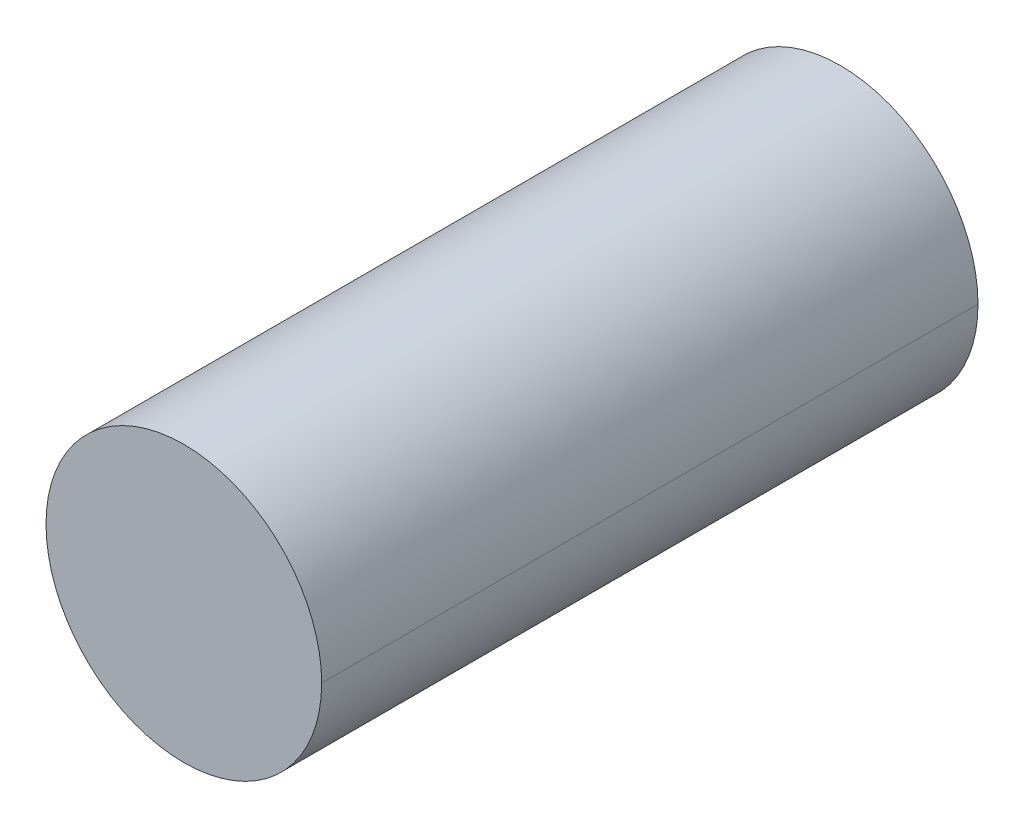
ISO-10303-21;
HEADER;
FILE_DESCRIPTION(('STEP AP214'),'2;1');
FILE_NAME('part.step','',(''),(''),'','','');
FILE_SCHEMA(('AUTOMOTIVE_DESIGN { 1 0 10303 214 1 1 1 1 }'));
ENDSEC;
DATA;
#1=APPLICATION_CONTEXT('core data for automotive mechanical design processes');
#2=APPLICATION_PROTOCOL_DEFINITION('international standard','automotive_design',2000,#1);
#3=PRODUCT_CONTEXT('',#1,'mechanical');
#4=PRODUCT('Part','Part','',(#3));
#5=PRODUCT_RELATED_PRODUCT_CATEGORY('part','',(#4));
#6=PRODUCT_DEFINITION_FORMATION('','',#4);
#7=PRODUCT_DEFINITION_CONTEXT('part definition',#1,'design');
#8=PRODUCT_DEFINITION('design','',#6,#7);
#9=PRODUCT_DEFINITION_SHAPE('','',#8);
#10=(LENGTH_UNIT() NAMED_UNIT(*) SI_UNIT(.MILLI.,.METRE.));
#11=(NAMED_UNIT(*) PLANE_ANGLE_UNIT() SI_UNIT($,.RADIAN.));
#12=(NAMED_UNIT(*) SI_UNIT($,.STERADIAN.) SOLID_ANGLE_UNIT());
#13=UNCERTAINTY_MEASURE_WITH_UNIT(LENGTH_MEASURE(1.E-05),#10,'distance_accuracy_value','');
#14=(GEOMETRIC_REPRESENTATION_CONTEXT(3) GLOBAL_UNCERTAINTY_ASSIGNED_CONTEXT((#13)) GLOBAL_UNIT_ASSIGNED_CONTEXT((#10,
#11,#12)) REPRESENTATION_CONTEXT('',''));
#15=CARTESIAN_POINT('',(0.,0.,0.));
#16=DIRECTION('',(0.,0.,1.));
#17=DIRECTION('',(1.,0.,0.));
#18=AXIS2_PLACEMENT_3D('',#15,#16,#17);
#19=CARTESIAN_POINT('',(0.,0.,-41.5));
#20=DIRECTION('',(0.,0.,-1.));
#21=DIRECTION('',(0.,-1.,0.));
#22=AXIS2_PLACEMENT_3D('',#19,#20,#21);
#23=PLANE('',#22);
#24=CARTESIAN_POINT('',(0.,0.,-41.5));
#25=DIRECTION('',(0.,0.,-1.));
#26=DIRECTION('',(-1.,0.,0.));
#27=AXIS2_PLACEMENT_3D('',#24,#25,#26);
#28=CIRCLE('',#27,2.1);
#29=CARTESIAN_POINT('',(-2.1,0.,-41.5));
#30=VERTEX_POINT('',#29);
#31=CARTESIAN_POINT('',(2.1,0.,-41.5));
#32=VERTEX_POINT('',#31);
#33=EDGE_CURVE('E11',#30,#32,#28,.T.);
#34=ORIENTED_EDGE('',*,*,#33,.T.);
#35=CARTESIAN_POINT('',(0.,0.,-41.5));
#36=DIRECTION('',(0.,0.,-1.));
#37=DIRECTION('',(1.,0.,0.));
#38=AXIS2_PLACEMENT_3D('',#35,#36,#37);
#39=CIRCLE('',#38,2.1);
#40=EDGE_CURVE('E20',#32,#30,#39,.T.);
#41=ORIENTED_EDGE('',*,*,#40,.T.);
#42=EDGE_LOOP('',(#34,#41));
#43=FACE_BOUND('',#42,.T.);
#44=ADVANCED_FACE('F16',(#43),#23,.T.);
#45=CARTESIAN_POINT('',(0.,0.,-41.5));
#46=DIRECTION('',(0.,0.,1.));
#47=DIRECTION('',(1.,0.,0.));
#48=AXIS2_PLACEMENT_3D('',#45,#46,#47);
#49=CYLINDRICAL_SURFACE('',#48,2.1);
#50=DIRECTION('',(0.,0.,-1.));
#51=VECTOR('',#50,1.);
#52=CARTESIAN_POINT('',(-2.1,0.,-31.5));
#53=LINE('',#52,#51);
#54=CARTESIAN_POINT('',(-2.1,0.,-31.5));
#55=VERTEX_POINT('',#54);
#56=EDGE_CURVE('E27',#55,#30,#53,.T.);
#57=ORIENTED_EDGE('',*,*,#56,.F.);
#58=CARTESIAN_POINT('',(0.,0.,-31.5));
#59=DIRECTION('',(0.,0.,1.));
#60=DIRECTION('',(1.,0.,0.));
#61=AXIS2_PLACEMENT_3D('',#58,#59,#60);
#62=CIRCLE('',#61,2.1);
#63=CARTESIAN_POINT('',(2.1,0.,-31.5));
#64=VERTEX_POINT('',#63);
#65=EDGE_CURVE('E56',#64,#55,#62,.T.);
#66=ORIENTED_EDGE('',*,*,#65,.F.);
#67=DIRECTION('',(0.,0.,-1.));
#68=VECTOR('',#67,1.);
#69=CARTESIAN_POINT('',(2.1,0.,-31.5));
#70=LINE('',#69,#68);
#71=EDGE_CURVE('E50',#64,#32,#70,.T.);
#72=ORIENTED_EDGE('',*,*,#71,.T.);
#73=ORIENTED_EDGE('',*,*,#33,.F.);
#74=EDGE_LOOP('',(#57,#66,#72,#73));
#75=FACE_BOUND('',#74,.T.);
#76=ADVANCED_FACE('F18',(#75),#49,.T.);
#77=CARTESIAN_POINT('',(0.,0.,-41.5));
#78=DIRECTION('',(0.,0.,1.));
#79=DIRECTION('',(1.,0.,0.));
#80=AXIS2_PLACEMENT_3D('',#77,#78,#79);
#81=CYLINDRICAL_SURFACE('',#80,2.1);
#82=ORIENTED_EDGE('',*,*,#40,.F.);
#83=ORIENTED_EDGE('',*,*,#71,.F.);
#84=CARTESIAN_POINT('',(0.,0.,-31.5));
#85=DIRECTION('',(0.,0.,1.));
#86=DIRECTION('',(-1.,0.,0.));
#87=AXIS2_PLACEMENT_3D('',#84,#85,#86);
#88=CIRCLE('',#87,2.1);
#89=EDGE_CURVE('E59',#55,#64,#88,.T.);
#90=ORIENTED_EDGE('',*,*,#89,.F.);
#91=ORIENTED_EDGE('',*,*,#56,.T.);
#92=EDGE_LOOP('',(#82,#83,#90,#91));
#93=FACE_BOUND('',#92,.T.);
#94=ADVANCED_FACE('F60',(#93),#81,.T.);
#95=CARTESIAN_POINT('',(0.,0.,-31.5));
#96=DIRECTION('',(0.,0.,-1.));
#97=DIRECTION('',(0.,-1.,0.));
#98=AXIS2_PLACEMENT_3D('',#95,#96,#97);
#99=PLANE('',#98);
#100=ORIENTED_EDGE('',*,*,#65,.T.);
#101=ORIENTED_EDGE('',*,*,#89,.T.);
#102=EDGE_LOOP('',(#100,#101));
#103=FACE_BOUND('',#102,.T.);
#104=ADVANCED_FACE('F64',(#103),#99,.F.);
#105=CLOSED_SHELL('',(#44,#76,#94,#104));
#106=MANIFOLD_SOLID_BREP('B1',#105);
#107=ADVANCED_BREP_SHAPE_REPRESENTATION('',(#18,#106),#14);
#108=SHAPE_DEFINITION_REPRESENTATION(#9,#107);
ENDSEC;
END-ISO-10303-21;
